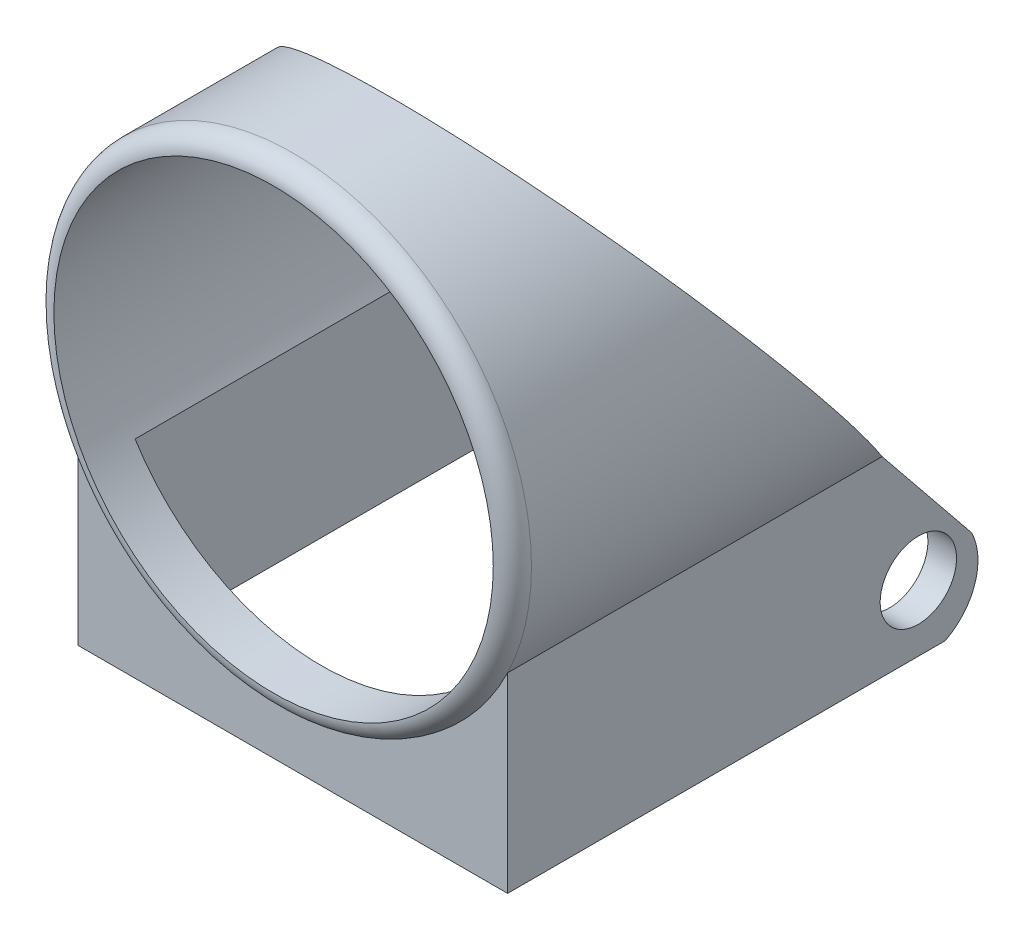
ISO-10303-21;
HEADER;
FILE_DESCRIPTION(('STEP AP214'),'2;1');
FILE_NAME('part.step','',(''),(''),'','','');
FILE_SCHEMA(('AUTOMOTIVE_DESIGN { 1 0 10303 214 1 1 1 1 }'));
ENDSEC;
DATA;
#1=APPLICATION_CONTEXT('core data for automotive mechanical design processes');
#2=APPLICATION_PROTOCOL_DEFINITION('international standard','automotive_design',2000,#1);
#3=PRODUCT_CONTEXT('',#1,'mechanical');
#4=PRODUCT('Part','Part','',(#3));
#5=PRODUCT_RELATED_PRODUCT_CATEGORY('part','',(#4));
#6=PRODUCT_DEFINITION_FORMATION('','',#4);
#7=PRODUCT_DEFINITION_CONTEXT('part definition',#1,'design');
#8=PRODUCT_DEFINITION('design','',#6,#7);
#9=PRODUCT_DEFINITION_SHAPE('','',#8);
#10=(LENGTH_UNIT() NAMED_UNIT(*) SI_UNIT(.MILLI.,.METRE.));
#11=(NAMED_UNIT(*) PLANE_ANGLE_UNIT() SI_UNIT($,.RADIAN.));
#12=(NAMED_UNIT(*) SI_UNIT($,.STERADIAN.) SOLID_ANGLE_UNIT());
#13=UNCERTAINTY_MEASURE_WITH_UNIT(LENGTH_MEASURE(1.E-05),#10,'distance_accuracy_value','');
#14=(GEOMETRIC_REPRESENTATION_CONTEXT(3) GLOBAL_UNCERTAINTY_ASSIGNED_CONTEXT((#13)) GLOBAL_UNIT_ASSIGNED_CONTEXT((#10,
#11,#12)) REPRESENTATION_CONTEXT('',''));
#15=CARTESIAN_POINT('',(0.,0.,0.));
#16=DIRECTION('',(0.,0.,1.));
#17=DIRECTION('',(1.,0.,0.));
#18=AXIS2_PLACEMENT_3D('',#15,#16,#17);
#19=CARTESIAN_POINT('',(0.,0.,50.));
#20=DIRECTION('',(0.,0.,-1.));
#21=DIRECTION('',(-1.,0.,0.));
#22=AXIS2_PLACEMENT_3D('',#19,#20,#21);
#23=CYLINDRICAL_SURFACE('',#22,25.);
#24=DIRECTION('',(0.,0.,-1.));
#25=VECTOR('',#24,1.);
#26=CARTESIAN_POINT('',(-22.5,-10.8972473588517,50.));
#27=LINE('',#26,#25);
#28=CARTESIAN_POINT('',(-22.5,-10.8972473588517,50.));
#29=VERTEX_POINT('',#28);
#30=CARTESIAN_POINT('',(-22.5,-10.8972473588517,10.7943726704199));
#31=VERTEX_POINT('',#30);
#32=EDGE_CURVE('E129',#29,#31,#27,.T.);
#33=ORIENTED_EDGE('',*,*,#32,.F.);
#34=CARTESIAN_POINT('',(0.,0.,50.));
#35=DIRECTION('',(0.,0.,1.));
#36=DIRECTION('',(1.,0.,0.));
#37=AXIS2_PLACEMENT_3D('',#34,#35,#36);
#38=CIRCLE('',#37,25.);
#39=CARTESIAN_POINT('',(22.5,-10.8972473588517,50.));
#40=VERTEX_POINT('',#39);
#41=EDGE_CURVE('E11',#29,#40,#38,.F.);
#42=ORIENTED_EDGE('',*,*,#41,.T.);
#43=DIRECTION('',(0.,0.,-1.));
#44=VECTOR('',#43,1.);
#45=CARTESIAN_POINT('',(22.5,-10.8972473588517,50.));
#46=LINE('',#45,#44);
#47=CARTESIAN_POINT('',(22.5,-10.8972473588517,10.7943726704199));
#48=VERTEX_POINT('',#47);
#49=EDGE_CURVE('E200',#40,#48,#46,.T.);
#50=ORIENTED_EDGE('',*,*,#49,.T.);
#51=CARTESIAN_POINT('',(0.,0.,19.6090441803067));
#52=DIRECTION('',(0.,-0.62890036531954,0.777485903731347));
#53=DIRECTION('',(0.,-0.777485903731347,-0.62890036531954));
#54=AXIS2_PLACEMENT_3D('',#51,#52,#53);
#55=ELLIPSE('',#54,32.1549238127905,25.);
#56=EDGE_CURVE('E159',#48,#31,#55,.T.);
#57=ORIENTED_EDGE('',*,*,#56,.T.);
#58=EDGE_LOOP('',(#33,#42,#50,#57));
#59=FACE_BOUND('',#58,.T.);
#60=ADVANCED_FACE('F35',(#59),#23,.T.);
#61=CARTESIAN_POINT('',(-22.5,-10.8972473588517,50.));
#62=DIRECTION('',(1.,0.,0.));
#63=DIRECTION('',(0.,1.,0.));
#64=AXIS2_PLACEMENT_3D('',#61,#62,#63);
#65=PLANE('',#64);
#66=CARTESIAN_POINT('',(-22.5,-24.,7.));
#67=DIRECTION('',(1.,0.,0.));
#68=DIRECTION('',(0.,1.,0.));
#69=AXIS2_PLACEMENT_3D('',#66,#67,#68);
#70=CIRCLE('',#69,4.00000000000001);
#71=CARTESIAN_POINT('',(-22.5,-20.,7.));
#72=VERTEX_POINT('',#71);
#73=EDGE_CURVE('E179',#72,#72,#70,.T.);
#74=ORIENTED_EDGE('',*,*,#73,.T.);
#75=EDGE_LOOP('',(#74));
#76=FACE_BOUND('',#75,.T.);
#77=DIRECTION('',(0.,-0.777485903731347,-0.62890036531954));
#78=VECTOR('',#77,1.);
#79=CARTESIAN_POINT('',(-22.5,8.27278200718501,26.3008126118091));
#80=LINE('',#79,#78);
#81=CARTESIAN_POINT('',(-22.5,-22.4712493008595,1.43228132624947));
#82=VERTEX_POINT('',#81);
#83=EDGE_CURVE('E162',#31,#82,#80,.T.);
#84=ORIENTED_EDGE('',*,*,#83,.T.);
#85=CARTESIAN_POINT('',(-22.5,-25.3082172590559,7.02131142604522));
#86=DIRECTION('',(1.,0.,0.));
#87=DIRECTION('',(0.,1.,0.));
#88=AXIS2_PLACEMENT_3D('',#85,#86,#87);
#89=CIRCLE('',#88,6.2678261504493);
#90=CARTESIAN_POINT('',(-22.5,-30.8972473588517,4.18434346784879));
#91=VERTEX_POINT('',#90);
#92=EDGE_CURVE('E170',#82,#91,#89,.F.);
#93=ORIENTED_EDGE('',*,*,#92,.T.);
#94=DIRECTION('',(0.,0.,-1.));
#95=VECTOR('',#94,1.);
#96=CARTESIAN_POINT('',(-22.5,-30.8972473588517,50.));
#97=LINE('',#96,#95);
#98=CARTESIAN_POINT('',(-22.5,-30.8972473588517,50.));
#99=VERTEX_POINT('',#98);
#100=EDGE_CURVE('E133',#99,#91,#97,.T.);
#101=ORIENTED_EDGE('',*,*,#100,.F.);
#102=DIRECTION('',(0.,-1.,0.));
#103=VECTOR('',#102,1.);
#104=CARTESIAN_POINT('',(-22.5,-10.8972473588517,50.));
#105=LINE('',#104,#103);
#106=EDGE_CURVE('E194',#29,#99,#105,.T.);
#107=ORIENTED_EDGE('',*,*,#106,.F.);
#108=ORIENTED_EDGE('',*,*,#32,.T.);
#109=EDGE_LOOP('',(#84,#93,#101,#107,#108));
#110=FACE_BOUND('',#109,.T.);
#111=ADVANCED_FACE('F211',(#76,#110),#65,.F.);
#112=CARTESIAN_POINT('',(-22.5,-30.8972473588517,50.));
#113=DIRECTION('',(0.,1.,0.));
#114=DIRECTION('',(-1.,0.,0.));
#115=AXIS2_PLACEMENT_3D('',#112,#113,#114);
#116=PLANE('',#115);
#117=ORIENTED_EDGE('',*,*,#100,.T.);
#118=DIRECTION('',(1.,0.,0.));
#119=VECTOR('',#118,1.);
#120=CARTESIAN_POINT('',(-250.,-30.8972473588517,4.18434346784879));
#121=LINE('',#120,#119);
#122=CARTESIAN_POINT('',(-19.5,-30.8972473588517,4.18434346784879));
#123=VERTEX_POINT('',#122);
#124=EDGE_CURVE('E151',#91,#123,#121,.T.);
#125=ORIENTED_EDGE('',*,*,#124,.T.);
#126=DIRECTION('',(0.,0.,-1.));
#127=VECTOR('',#126,1.);
#128=CARTESIAN_POINT('',(-19.5,-30.8972473588517,50.));
#129=LINE('',#128,#127);
#130=CARTESIAN_POINT('',(-19.5,-30.8972473588517,47.));
#131=VERTEX_POINT('',#130);
#132=EDGE_CURVE('E189',#131,#123,#129,.T.);
#133=ORIENTED_EDGE('',*,*,#132,.F.);
#134=DIRECTION('',(1.,0.,0.));
#135=VECTOR('',#134,1.);
#136=CARTESIAN_POINT('',(-22.5,-30.8972473588517,47.));
#137=LINE('',#136,#135);
#138=CARTESIAN_POINT('',(19.5,-30.8972473588517,47.));
#139=VERTEX_POINT('',#138);
#140=EDGE_CURVE('E184',#131,#139,#137,.T.);
#141=ORIENTED_EDGE('',*,*,#140,.T.);
#142=DIRECTION('',(0.,0.,-1.));
#143=VECTOR('',#142,1.);
#144=CARTESIAN_POINT('',(19.5,-30.8972473588517,50.));
#145=LINE('',#144,#143);
#146=CARTESIAN_POINT('',(19.5,-30.8972473588517,4.18434346784879));
#147=VERTEX_POINT('',#146);
#148=EDGE_CURVE('E186',#139,#147,#145,.T.);
#149=ORIENTED_EDGE('',*,*,#148,.T.);
#150=CARTESIAN_POINT('',(22.5,-30.8972473588517,4.18434346784879));
#151=VERTEX_POINT('',#150);
#152=EDGE_CURVE('E146',#147,#151,#121,.T.);
#153=ORIENTED_EDGE('',*,*,#152,.T.);
#154=DIRECTION('',(0.,0.,-1.));
#155=VECTOR('',#154,1.);
#156=CARTESIAN_POINT('',(22.5,-30.8972473588517,50.));
#157=LINE('',#156,#155);
#158=CARTESIAN_POINT('',(22.5,-30.8972473588517,50.));
#159=VERTEX_POINT('',#158);
#160=EDGE_CURVE('E198',#159,#151,#157,.T.);
#161=ORIENTED_EDGE('',*,*,#160,.F.);
#162=DIRECTION('',(1.,0.,0.));
#163=VECTOR('',#162,1.);
#164=CARTESIAN_POINT('',(-22.5,-30.8972473588517,50.));
#165=LINE('',#164,#163);
#166=EDGE_CURVE('E195',#99,#159,#165,.T.);
#167=ORIENTED_EDGE('',*,*,#166,.F.);
#168=EDGE_LOOP('',(#117,#125,#133,#141,#149,#153,#161,#167));
#169=FACE_BOUND('',#168,.T.);
#170=ADVANCED_FACE('F206',(#169),#116,.F.);
#171=CARTESIAN_POINT('',(22.5,-30.8972473588517,50.));
#172=DIRECTION('',(-1.,0.,0.));
#173=DIRECTION('',(0.,0.,1.));
#174=AXIS2_PLACEMENT_3D('',#171,#172,#173);
#175=PLANE('',#174);
#176=CARTESIAN_POINT('',(22.5,-24.,7.));
#177=DIRECTION('',(-1.,0.,0.));
#178=DIRECTION('',(0.,0.,1.));
#179=AXIS2_PLACEMENT_3D('',#176,#177,#178);
#180=CIRCLE('',#179,4.00000000000001);
#181=CARTESIAN_POINT('',(22.5,-24.,11.));
#182=VERTEX_POINT('',#181);
#183=EDGE_CURVE('E176',#182,#182,#180,.T.);
#184=ORIENTED_EDGE('',*,*,#183,.T.);
#185=EDGE_LOOP('',(#184));
#186=FACE_BOUND('',#185,.T.);
#187=ORIENTED_EDGE('',*,*,#160,.T.);
#188=CARTESIAN_POINT('',(22.5,-25.3082172590559,7.02131142604522));
#189=DIRECTION('',(-1.,0.,0.));
#190=DIRECTION('',(0.,0.,1.));
#191=AXIS2_PLACEMENT_3D('',#188,#189,#190);
#192=CIRCLE('',#191,6.2678261504493);
#193=CARTESIAN_POINT('',(22.5,-22.4712493008595,1.43228132624947));
#194=VERTEX_POINT('',#193);
#195=EDGE_CURVE('E167',#151,#194,#192,.F.);
#196=ORIENTED_EDGE('',*,*,#195,.T.);
#197=DIRECTION('',(0.,0.777485903731347,0.62890036531954));
#198=VECTOR('',#197,1.);
#199=CARTESIAN_POINT('',(22.5,-3.81690460283395,16.5215892340604));
#200=LINE('',#199,#198);
#201=EDGE_CURVE('E156',#194,#48,#200,.T.);
#202=ORIENTED_EDGE('',*,*,#201,.T.);
#203=ORIENTED_EDGE('',*,*,#49,.F.);
#204=DIRECTION('',(0.,1.,0.));
#205=VECTOR('',#204,1.);
#206=CARTESIAN_POINT('',(22.5,-30.8972473588517,50.));
#207=LINE('',#206,#205);
#208=EDGE_CURVE('E197',#159,#40,#207,.T.);
#209=ORIENTED_EDGE('',*,*,#208,.F.);
#210=EDGE_LOOP('',(#187,#196,#202,#203,#209));
#211=FACE_BOUND('',#210,.T.);
#212=ADVANCED_FACE('F250',(#186,#211),#175,.F.);
#213=CARTESIAN_POINT('',(0.,0.,50.));
#214=DIRECTION('',(0.,0.,1.));
#215=DIRECTION('',(1.,0.,0.));
#216=AXIS2_PLACEMENT_3D('',#213,#214,#215);
#217=PLANE('',#216);
#218=CARTESIAN_POINT('',(0.,0.,50.));
#219=DIRECTION('',(0.,0.,1.));
#220=DIRECTION('',(1.,0.,0.));
#221=AXIS2_PLACEMENT_3D('',#218,#219,#220);
#222=CIRCLE('',#221,25.);
#223=EDGE_CURVE('E142',#29,#40,#222,.T.);
#224=ORIENTED_EDGE('',*,*,#223,.F.);
#225=ORIENTED_EDGE('',*,*,#106,.T.);
#226=ORIENTED_EDGE('',*,*,#166,.T.);
#227=ORIENTED_EDGE('',*,*,#208,.T.);
#228=EDGE_LOOP('',(#224,#225,#226,#227));
#229=FACE_BOUND('',#228,.T.);
#230=ADVANCED_FACE('F253',(#229),#217,.T.);
#231=CARTESIAN_POINT('',(-19.5,-10.8972473588517,50.));
#232=DIRECTION('',(1.,0.,0.));
#233=DIRECTION('',(0.,1.,0.));
#234=AXIS2_PLACEMENT_3D('',#231,#232,#233);
#235=PLANE('',#234);
#236=DIRECTION('',(0.,0.,1.));
#237=VECTOR('',#236,1.);
#238=CARTESIAN_POINT('',(-19.5,-12.1963109176505,0.753485275595919));
#239=LINE('',#238,#237);
#240=CARTESIAN_POINT('',(-19.5,-12.1963109176505,47.));
#241=VERTEX_POINT('',#240);
#242=CARTESIAN_POINT('',(-19.5,-12.1963109176505,9.74357349479379));
#243=VERTEX_POINT('',#242);
#244=EDGE_CURVE('E51',#241,#243,#239,.F.);
#245=ORIENTED_EDGE('',*,*,#244,.F.);
#246=DIRECTION('',(0.,-1.,0.));
#247=VECTOR('',#246,1.);
#248=CARTESIAN_POINT('',(-19.5,-10.8972473588517,47.));
#249=LINE('',#248,#247);
#250=EDGE_CURVE('E182',#241,#131,#249,.T.);
#251=ORIENTED_EDGE('',*,*,#250,.T.);
#252=ORIENTED_EDGE('',*,*,#132,.T.);
#253=CARTESIAN_POINT('',(-19.5,-25.3082172590559,7.02131142604522));
#254=DIRECTION('',(1.,0.,0.));
#255=DIRECTION('',(0.,1.,0.));
#256=AXIS2_PLACEMENT_3D('',#253,#254,#255);
#257=CIRCLE('',#256,6.2678261504493);
#258=CARTESIAN_POINT('',(-19.5,-22.4712493008595,1.43228132624947));
#259=VERTEX_POINT('',#258);
#260=EDGE_CURVE('E165',#259,#123,#257,.F.);
#261=ORIENTED_EDGE('',*,*,#260,.F.);
#262=DIRECTION('',(0.,-0.777485903731347,-0.62890036531954));
#263=VECTOR('',#262,1.);
#264=CARTESIAN_POINT('',(-19.5,8.27278200718501,26.3008126118091));
#265=LINE('',#264,#263);
#266=EDGE_CURVE('E154',#243,#259,#265,.T.);
#267=ORIENTED_EDGE('',*,*,#266,.F.);
#268=EDGE_LOOP('',(#245,#251,#252,#261,#267));
#269=FACE_BOUND('',#268,.T.);
#270=CARTESIAN_POINT('',(-19.5,-24.,7.));
#271=DIRECTION('',(1.,0.,0.));
#272=DIRECTION('',(0.,1.,0.));
#273=AXIS2_PLACEMENT_3D('',#270,#271,#272);
#274=CIRCLE('',#273,4.00000000000001);
#275=CARTESIAN_POINT('',(-19.5,-20.,7.));
#276=VERTEX_POINT('',#275);
#277=EDGE_CURVE('E173',#276,#276,#274,.T.);
#278=ORIENTED_EDGE('',*,*,#277,.F.);
#279=EDGE_LOOP('',(#278));
#280=FACE_BOUND('',#279,.T.);
#281=ADVANCED_FACE('F219',(#269,#280),#235,.T.);
#282=CARTESIAN_POINT('',(19.5,-30.8972473588517,50.));
#283=DIRECTION('',(-1.,0.,0.));
#284=DIRECTION('',(0.,0.,1.));
#285=AXIS2_PLACEMENT_3D('',#282,#283,#284);
#286=PLANE('',#285);
#287=DIRECTION('',(0.,0.,1.));
#288=VECTOR('',#287,1.);
#289=CARTESIAN_POINT('',(19.5,-12.1963109176505,0.753485275595919));
#290=LINE('',#289,#288);
#291=CARTESIAN_POINT('',(19.5,-12.1963109176505,9.74357349479379));
#292=VERTEX_POINT('',#291);
#293=CARTESIAN_POINT('',(19.5,-12.1963109176505,47.));
#294=VERTEX_POINT('',#293);
#295=EDGE_CURVE('E113',#292,#294,#290,.T.);
#296=ORIENTED_EDGE('',*,*,#295,.F.);
#297=DIRECTION('',(0.,0.777485903731347,0.62890036531954));
#298=VECTOR('',#297,1.);
#299=CARTESIAN_POINT('',(19.5,-3.81690460283395,16.5215892340604));
#300=LINE('',#299,#298);
#301=CARTESIAN_POINT('',(19.5,-22.4712493008595,1.43228132624946));
#302=VERTEX_POINT('',#301);
#303=EDGE_CURVE('E124',#302,#292,#300,.T.);
#304=ORIENTED_EDGE('',*,*,#303,.F.);
#305=CARTESIAN_POINT('',(19.5,-25.3082172590559,7.02131142604522));
#306=DIRECTION('',(-1.,0.,0.));
#307=DIRECTION('',(0.,0.,1.));
#308=AXIS2_PLACEMENT_3D('',#305,#306,#307);
#309=CIRCLE('',#308,6.2678261504493);
#310=EDGE_CURVE('E44',#147,#302,#309,.F.);
#311=ORIENTED_EDGE('',*,*,#310,.F.);
#312=ORIENTED_EDGE('',*,*,#148,.F.);
#313=DIRECTION('',(0.,1.,0.));
#314=VECTOR('',#313,1.);
#315=CARTESIAN_POINT('',(19.5,-30.8972473588517,47.));
#316=LINE('',#315,#314);
#317=EDGE_CURVE('E126',#139,#294,#316,.T.);
#318=ORIENTED_EDGE('',*,*,#317,.T.);
#319=EDGE_LOOP('',(#296,#304,#311,#312,#318));
#320=FACE_BOUND('',#319,.T.);
#321=CARTESIAN_POINT('',(19.5,-24.,7.));
#322=DIRECTION('',(-1.,0.,0.));
#323=DIRECTION('',(0.,0.,1.));
#324=AXIS2_PLACEMENT_3D('',#321,#322,#323);
#325=CIRCLE('',#324,4.00000000000001);
#326=CARTESIAN_POINT('',(19.5,-24.,11.));
#327=VERTEX_POINT('',#326);
#328=EDGE_CURVE('E136',#327,#327,#325,.T.);
#329=ORIENTED_EDGE('',*,*,#328,.F.);
#330=EDGE_LOOP('',(#329));
#331=FACE_BOUND('',#330,.T.);
#332=ADVANCED_FACE('F121',(#320,#331),#286,.T.);
#333=CARTESIAN_POINT('',(0.,0.,47.));
#334=DIRECTION('',(0.,0.,1.));
#335=DIRECTION('',(1.,0.,0.));
#336=AXIS2_PLACEMENT_3D('',#333,#334,#335);
#337=PLANE('',#336);
#338=ORIENTED_EDGE('',*,*,#250,.F.);
#339=CARTESIAN_POINT('',(0.,0.,47.));
#340=DIRECTION('',(0.,0.,1.));
#341=DIRECTION('',(1.,0.,0.));
#342=AXIS2_PLACEMENT_3D('',#339,#340,#341);
#343=CIRCLE('',#342,23.);
#344=EDGE_CURVE('E147',#241,#294,#343,.T.);
#345=ORIENTED_EDGE('',*,*,#344,.T.);
#346=ORIENTED_EDGE('',*,*,#317,.F.);
#347=ORIENTED_EDGE('',*,*,#140,.F.);
#348=EDGE_LOOP('',(#338,#345,#346,#347));
#349=FACE_BOUND('',#348,.T.);
#350=ADVANCED_FACE('F224',(#349),#337,.F.);
#351=CARTESIAN_POINT('',(-250.,-24.,7.));
#352=DIRECTION('',(1.,0.,0.));
#353=DIRECTION('',(0.,0.,-1.));
#354=AXIS2_PLACEMENT_3D('',#351,#352,#353);
#355=CYLINDRICAL_SURFACE('',#354,4.00000000000001);
#356=ORIENTED_EDGE('',*,*,#328,.T.);
#357=EDGE_LOOP('',(#356));
#358=FACE_BOUND('',#357,.T.);
#359=ORIENTED_EDGE('',*,*,#183,.F.);
#360=EDGE_LOOP('',(#359));
#361=FACE_BOUND('',#360,.T.);
#362=ADVANCED_FACE('F260',(#358,#361),#355,.F.);
#363=ORIENTED_EDGE('',*,*,#277,.T.);
#364=EDGE_LOOP('',(#363));
#365=FACE_BOUND('',#364,.T.);
#366=ORIENTED_EDGE('',*,*,#73,.F.);
#367=EDGE_LOOP('',(#366));
#368=FACE_BOUND('',#367,.T.);
#369=ADVANCED_FACE('F265',(#365,#368),#355,.F.);
#370=CARTESIAN_POINT('',(-250.,-25.3082172590559,7.02131142604522));
#371=DIRECTION('',(1.,0.,0.));
#372=DIRECTION('',(0.,0.,-1.));
#373=AXIS2_PLACEMENT_3D('',#370,#371,#372);
#374=CYLINDRICAL_SURFACE('',#373,6.2678261504493);
#375=DIRECTION('',(1.,0.,0.));
#376=VECTOR('',#375,1.);
#377=CARTESIAN_POINT('',(-250.,-22.4712493008595,1.43228132624947));
#378=LINE('',#377,#376);
#379=EDGE_CURVE('E150',#82,#259,#378,.T.);
#380=ORIENTED_EDGE('',*,*,#379,.T.);
#381=ORIENTED_EDGE('',*,*,#260,.T.);
#382=ORIENTED_EDGE('',*,*,#124,.F.);
#383=ORIENTED_EDGE('',*,*,#92,.F.);
#384=EDGE_LOOP('',(#380,#381,#382,#383));
#385=FACE_BOUND('',#384,.T.);
#386=ADVANCED_FACE('F216',(#385),#374,.T.);
#387=ORIENTED_EDGE('',*,*,#152,.F.);
#388=ORIENTED_EDGE('',*,*,#310,.T.);
#389=EDGE_CURVE('E59',#302,#194,#378,.T.);
#390=ORIENTED_EDGE('',*,*,#389,.T.);
#391=ORIENTED_EDGE('',*,*,#195,.F.);
#392=EDGE_LOOP('',(#387,#388,#390,#391));
#393=FACE_BOUND('',#392,.T.);
#394=ADVANCED_FACE('F237',(#393),#374,.T.);
#395=CARTESIAN_POINT('',(-250.,25.2085729118079,40.));
#396=DIRECTION('',(0.,-0.62890036531954,0.777485903731347));
#397=DIRECTION('',(0.,-0.777485903731347,-0.62890036531954));
#398=AXIS2_PLACEMENT_3D('',#395,#396,#397);
#399=PLANE('',#398);
#400=ORIENTED_EDGE('',*,*,#303,.T.);
#401=CARTESIAN_POINT('',(0.,0.,19.6090441803067));
#402=DIRECTION('',(0.,-0.62890036531954,0.777485903731347));
#403=DIRECTION('',(0.,0.777485903731347,0.62890036531954));
#404=AXIS2_PLACEMENT_3D('',#401,#402,#403);
#405=ELLIPSE('',#404,29.5825299077672,23.);
#406=EDGE_CURVE('E110',#292,#243,#405,.T.);
#407=ORIENTED_EDGE('',*,*,#406,.T.);
#408=ORIENTED_EDGE('',*,*,#266,.T.);
#409=ORIENTED_EDGE('',*,*,#379,.F.);
#410=ORIENTED_EDGE('',*,*,#83,.F.);
#411=ORIENTED_EDGE('',*,*,#56,.F.);
#412=ORIENTED_EDGE('',*,*,#201,.F.);
#413=ORIENTED_EDGE('',*,*,#389,.F.);
#414=EDGE_LOOP('',(#400,#407,#408,#409,#410,#411,#412,#413));
#415=FACE_BOUND('',#414,.T.);
#416=ADVANCED_FACE('F128',(#415),#399,.F.);
#417=CARTESIAN_POINT('',(0.,0.,50.));
#418=DIRECTION('',(0.,0.,1.));
#419=DIRECTION('',(1.,0.,0.));
#420=AXIS2_PLACEMENT_3D('',#417,#418,#419);
#421=TOROIDAL_SURFACE('',#420,23.,2.);
#422=ORIENTED_EDGE('',*,*,#41,.F.);
#423=ORIENTED_EDGE('',*,*,#223,.T.);
#424=EDGE_LOOP('',(#422,#423));
#425=FACE_BOUND('',#424,.T.);
#426=CARTESIAN_POINT('',(0.,0.,52.));
#427=DIRECTION('',(0.,0.,1.));
#428=DIRECTION('',(1.,0.,0.));
#429=AXIS2_PLACEMENT_3D('',#426,#427,#428);
#430=CIRCLE('',#429,23.);
#431=CARTESIAN_POINT('',(23.,0.,52.));
#432=VERTEX_POINT('',#431);
#433=EDGE_CURVE('E116',#432,#432,#430,.T.);
#434=ORIENTED_EDGE('',*,*,#433,.F.);
#435=EDGE_LOOP('',(#434));
#436=FACE_BOUND('',#435,.T.);
#437=ADVANCED_FACE('F37',(#425,#436),#421,.T.);
#438=CARTESIAN_POINT('',(0.,0.,0.753485275595919));
#439=DIRECTION('',(0.,0.,1.));
#440=DIRECTION('',(1.,0.,0.));
#441=AXIS2_PLACEMENT_3D('',#438,#439,#440);
#442=CYLINDRICAL_SURFACE('',#441,23.);
#443=ORIENTED_EDGE('',*,*,#433,.T.);
#444=EDGE_LOOP('',(#443));
#445=FACE_BOUND('',#444,.T.);
#446=ORIENTED_EDGE('',*,*,#244,.T.);
#447=ORIENTED_EDGE('',*,*,#406,.F.);
#448=ORIENTED_EDGE('',*,*,#295,.T.);
#449=ORIENTED_EDGE('',*,*,#344,.F.);
#450=EDGE_LOOP('',(#446,#447,#448,#449));
#451=FACE_BOUND('',#450,.T.);
#452=ADVANCED_FACE('F112',(#445,#451),#442,.F.);
#453=CLOSED_SHELL('',(#60,#111,#170,#212,#230,#281,#332,#350,#362,#369,#386,#394,#416,#437,#452));
#454=MANIFOLD_SOLID_BREP('B2',#453);
#455=ADVANCED_BREP_SHAPE_REPRESENTATION('',(#18,#454),#14);
#456=SHAPE_DEFINITION_REPRESENTATION(#9,#455);
ENDSEC;
END-ISO-10303-21;
